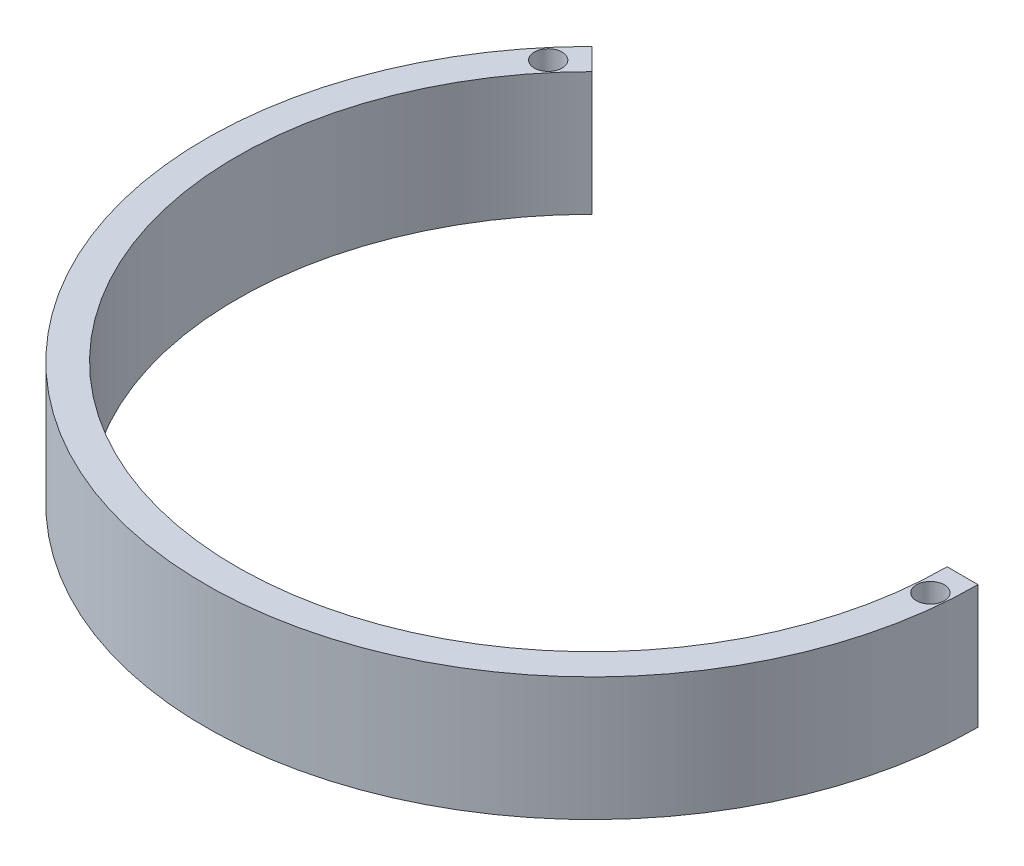
ISO-10303-21;
HEADER;
FILE_DESCRIPTION(('STEP AP214'),'2;1');
FILE_NAME('part.step','',(''),(''),'','','');
FILE_SCHEMA(('AUTOMOTIVE_DESIGN { 1 0 10303 214 1 1 1 1 }'));
ENDSEC;
DATA;
#1=APPLICATION_CONTEXT('core data for automotive mechanical design processes');
#2=APPLICATION_PROTOCOL_DEFINITION('international standard','automotive_design',2000,#1);
#3=PRODUCT_CONTEXT('',#1,'mechanical');
#4=PRODUCT('Part','Part','',(#3));
#5=PRODUCT_RELATED_PRODUCT_CATEGORY('part','',(#4));
#6=PRODUCT_DEFINITION_FORMATION('','',#4);
#7=PRODUCT_DEFINITION_CONTEXT('part definition',#1,'design');
#8=PRODUCT_DEFINITION('design','',#6,#7);
#9=PRODUCT_DEFINITION_SHAPE('','',#8);
#10=(LENGTH_UNIT() NAMED_UNIT(*) SI_UNIT(.MILLI.,.METRE.));
#11=(NAMED_UNIT(*) PLANE_ANGLE_UNIT() SI_UNIT($,.RADIAN.));
#12=(NAMED_UNIT(*) SI_UNIT($,.STERADIAN.) SOLID_ANGLE_UNIT());
#13=UNCERTAINTY_MEASURE_WITH_UNIT(LENGTH_MEASURE(1.E-05),#10,'distance_accuracy_value','');
#14=(GEOMETRIC_REPRESENTATION_CONTEXT(3) GLOBAL_UNCERTAINTY_ASSIGNED_CONTEXT((#13)) GLOBAL_UNIT_ASSIGNED_CONTEXT((#10,
#11,#12)) REPRESENTATION_CONTEXT('',''));
#15=CARTESIAN_POINT('',(0.,0.,0.));
#16=DIRECTION('',(0.,0.,1.));
#17=DIRECTION('',(1.,0.,0.));
#18=AXIS2_PLACEMENT_3D('',#15,#16,#17);
#19=CARTESIAN_POINT('',(0.,0.,0.));
#20=DIRECTION('',(0.,0.,-1.));
#21=DIRECTION('',(-1.,0.,0.));
#22=AXIS2_PLACEMENT_3D('',#19,#20,#21);
#23=PLANE('',#22);
#24=DIRECTION('',(-1.,0.,0.));
#25=VECTOR('',#24,1.);
#26=CARTESIAN_POINT('',(62.5,-10.,0.));
#27=LINE('',#26,#25);
#28=CARTESIAN_POINT('',(62.5,-10.,0.));
#29=VERTEX_POINT('',#28);
#30=CARTESIAN_POINT('',(57.5,-10.,0.));
#31=VERTEX_POINT('',#30);
#32=EDGE_CURVE('E92',#29,#31,#27,.T.);
#33=ORIENTED_EDGE('',*,*,#32,.T.);
#34=DIRECTION('',(0.,1.,0.));
#35=VECTOR('',#34,1.);
#36=CARTESIAN_POINT('',(57.5,-10.,0.));
#37=LINE('',#36,#35);
#38=CARTESIAN_POINT('',(57.5,10.,0.));
#39=VERTEX_POINT('',#38);
#40=EDGE_CURVE('E85',#31,#39,#37,.T.);
#41=ORIENTED_EDGE('',*,*,#40,.T.);
#42=DIRECTION('',(1.,0.,0.));
#43=VECTOR('',#42,1.);
#44=CARTESIAN_POINT('',(62.5,10.,0.));
#45=LINE('',#44,#43);
#46=CARTESIAN_POINT('',(62.5,10.,0.));
#47=VERTEX_POINT('',#46);
#48=EDGE_CURVE('E80',#39,#47,#45,.T.);
#49=ORIENTED_EDGE('',*,*,#48,.T.);
#50=DIRECTION('',(0.,-1.,0.));
#51=VECTOR('',#50,1.);
#52=CARTESIAN_POINT('',(62.5,-10.,0.));
#53=LINE('',#52,#51);
#54=EDGE_CURVE('E75',#47,#29,#53,.T.);
#55=ORIENTED_EDGE('',*,*,#54,.T.);
#56=EDGE_LOOP('',(#33,#41,#49,#55));
#57=FACE_BOUND('',#56,.T.);
#58=ADVANCED_FACE('F41',(#57),#23,.T.);
#59=CARTESIAN_POINT('',(0.,0.,0.));
#60=DIRECTION('',(-0.707106781186544,0.,0.707106781186551));
#61=DIRECTION('',(0.707106781186551,0.,0.707106781186544));
#62=AXIS2_PLACEMENT_3D('',#59,#60,#61);
#63=PLANE('',#62);
#64=DIRECTION('',(0.707106781186551,0.,0.707106781186544));
#65=VECTOR('',#64,1.);
#66=CARTESIAN_POINT('',(-44.1941738241594,-10.,-44.194173824159));
#67=LINE('',#66,#65);
#68=CARTESIAN_POINT('',(-44.1941738241594,-10.,-44.194173824159));
#69=VERTEX_POINT('',#68);
#70=CARTESIAN_POINT('',(-40.6586399182267,-10.,-40.6586399182263));
#71=VERTEX_POINT('',#70);
#72=EDGE_CURVE('E108',#69,#71,#67,.T.);
#73=ORIENTED_EDGE('',*,*,#72,.F.);
#74=DIRECTION('',(0.,-1.,0.));
#75=VECTOR('',#74,1.);
#76=CARTESIAN_POINT('',(-44.1941738241594,-10.,-44.194173824159));
#77=LINE('',#76,#75);
#78=CARTESIAN_POINT('',(-44.1941738241594,10.,-44.194173824159));
#79=VERTEX_POINT('',#78);
#80=EDGE_CURVE('E11',#79,#69,#77,.T.);
#81=ORIENTED_EDGE('',*,*,#80,.F.);
#82=DIRECTION('',(-0.707106781186551,0.,-0.707106781186544));
#83=VECTOR('',#82,1.);
#84=CARTESIAN_POINT('',(-44.1941738241594,10.,-44.194173824159));
#85=LINE('',#84,#83);
#86=CARTESIAN_POINT('',(-40.6586399182267,10.,-40.6586399182263));
#87=VERTEX_POINT('',#86);
#88=EDGE_CURVE('E48',#87,#79,#85,.T.);
#89=ORIENTED_EDGE('',*,*,#88,.F.);
#90=DIRECTION('',(0.,1.,0.));
#91=VECTOR('',#90,1.);
#92=CARTESIAN_POINT('',(-40.6586399182267,-10.,-40.6586399182263));
#93=LINE('',#92,#91);
#94=EDGE_CURVE('E63',#71,#87,#93,.T.);
#95=ORIENTED_EDGE('',*,*,#94,.F.);
#96=EDGE_LOOP('',(#73,#81,#89,#95));
#97=FACE_BOUND('',#96,.T.);
#98=ADVANCED_FACE('F131',(#97),#63,.F.);
#99=CARTESIAN_POINT('',(62.5,-10.,0.));
#100=DIRECTION('',(0.,1.,0.));
#101=DIRECTION('',(0.,0.,1.));
#102=AXIS2_PLACEMENT_3D('',#99,#100,#101);
#103=PLANE('',#102);
#104=CARTESIAN_POINT('',(59.791303715507,-10.,4.99999999999999));
#105=DIRECTION('',(0.,-1.,0.));
#106=DIRECTION('',(0.,0.,-1.));
#107=AXIS2_PLACEMENT_3D('',#104,#105,#106);
#108=CIRCLE('',#107,2.24999999999999);
#109=CARTESIAN_POINT('',(59.791303715507,-10.,2.75));
#110=VERTEX_POINT('',#109);
#111=EDGE_CURVE('E122',#110,#110,#108,.T.);
#112=ORIENTED_EDGE('',*,*,#111,.F.);
#113=EDGE_LOOP('',(#112));
#114=FACE_BOUND('',#113,.T.);
#115=CARTESIAN_POINT('',(-45.8143702191521,-10.,-38.7433024072867));
#116=DIRECTION('',(0.,-1.,0.));
#117=DIRECTION('',(0.,0.,-1.));
#118=AXIS2_PLACEMENT_3D('',#115,#116,#117);
#119=CIRCLE('',#118,2.24999999999999);
#120=CARTESIAN_POINT('',(-45.8143702191521,-10.,-40.9933024072866));
#121=VERTEX_POINT('',#120);
#122=EDGE_CURVE('E116',#121,#121,#119,.T.);
#123=ORIENTED_EDGE('',*,*,#122,.F.);
#124=EDGE_LOOP('',(#123));
#125=FACE_BOUND('',#124,.T.);
#126=CARTESIAN_POINT('',(0.,-10.,0.));
#127=DIRECTION('',(0.,-1.,0.));
#128=DIRECTION('',(1.,0.,0.));
#129=AXIS2_PLACEMENT_3D('',#126,#127,#128);
#130=CIRCLE('',#129,57.5);
#131=EDGE_CURVE('E95',#31,#71,#130,.T.);
#132=ORIENTED_EDGE('',*,*,#131,.F.);
#133=ORIENTED_EDGE('',*,*,#32,.F.);
#134=CARTESIAN_POINT('',(0.,-10.,0.));
#135=DIRECTION('',(0.,-1.,0.));
#136=DIRECTION('',(1.,0.,0.));
#137=AXIS2_PLACEMENT_3D('',#134,#135,#136);
#138=CIRCLE('',#137,62.5);
#139=EDGE_CURVE('E94',#29,#69,#138,.T.);
#140=ORIENTED_EDGE('',*,*,#139,.T.);
#141=ORIENTED_EDGE('',*,*,#72,.T.);
#142=EDGE_LOOP('',(#132,#133,#140,#141));
#143=FACE_BOUND('',#142,.T.);
#144=ADVANCED_FACE('F93',(#114,#125,#143),#103,.F.);
#145=CARTESIAN_POINT('',(0.,0.,0.));
#146=DIRECTION('',(0.,-1.,0.));
#147=DIRECTION('',(0.,0.,-1.));
#148=AXIS2_PLACEMENT_3D('',#145,#146,#147);
#149=CYLINDRICAL_SURFACE('',#148,57.5);
#150=CARTESIAN_POINT('',(0.,10.,0.));
#151=DIRECTION('',(0.,-1.,0.));
#152=DIRECTION('',(1.,0.,0.));
#153=AXIS2_PLACEMENT_3D('',#150,#151,#152);
#154=CIRCLE('',#153,57.5);
#155=EDGE_CURVE('E102',#39,#87,#154,.T.);
#156=ORIENTED_EDGE('',*,*,#155,.F.);
#157=ORIENTED_EDGE('',*,*,#40,.F.);
#158=ORIENTED_EDGE('',*,*,#131,.T.);
#159=ORIENTED_EDGE('',*,*,#94,.T.);
#160=EDGE_LOOP('',(#156,#157,#158,#159));
#161=FACE_BOUND('',#160,.T.);
#162=ADVANCED_FACE('F130',(#161),#149,.F.);
#163=CARTESIAN_POINT('',(62.5,10.,0.));
#164=DIRECTION('',(0.,-1.,0.));
#165=DIRECTION('',(0.,0.,-1.));
#166=AXIS2_PLACEMENT_3D('',#163,#164,#165);
#167=PLANE('',#166);
#168=CARTESIAN_POINT('',(59.791303715507,10.,4.99999999999999));
#169=DIRECTION('',(0.,-1.,0.));
#170=DIRECTION('',(0.,0.,-1.));
#171=AXIS2_PLACEMENT_3D('',#168,#169,#170);
#172=CIRCLE('',#171,2.25);
#173=CARTESIAN_POINT('',(59.791303715507,10.,2.75));
#174=VERTEX_POINT('',#173);
#175=EDGE_CURVE('E119',#174,#174,#172,.T.);
#176=ORIENTED_EDGE('',*,*,#175,.T.);
#177=EDGE_LOOP('',(#176));
#178=FACE_BOUND('',#177,.T.);
#179=CARTESIAN_POINT('',(-45.8143702191521,10.,-38.7433024072867));
#180=DIRECTION('',(0.,-1.,0.));
#181=DIRECTION('',(0.,0.,-1.));
#182=AXIS2_PLACEMENT_3D('',#179,#180,#181);
#183=CIRCLE('',#182,2.25);
#184=CARTESIAN_POINT('',(-45.8143702191521,10.,-40.9933024072867));
#185=VERTEX_POINT('',#184);
#186=EDGE_CURVE('E97',#185,#185,#183,.T.);
#187=ORIENTED_EDGE('',*,*,#186,.T.);
#188=EDGE_LOOP('',(#187));
#189=FACE_BOUND('',#188,.T.);
#190=CARTESIAN_POINT('',(0.,10.,0.));
#191=DIRECTION('',(0.,-1.,0.));
#192=DIRECTION('',(1.,0.,0.));
#193=AXIS2_PLACEMENT_3D('',#190,#191,#192);
#194=CIRCLE('',#193,62.5);
#195=EDGE_CURVE('E110',#47,#79,#194,.T.);
#196=ORIENTED_EDGE('',*,*,#195,.F.);
#197=ORIENTED_EDGE('',*,*,#48,.F.);
#198=ORIENTED_EDGE('',*,*,#155,.T.);
#199=ORIENTED_EDGE('',*,*,#88,.T.);
#200=EDGE_LOOP('',(#196,#197,#198,#199));
#201=FACE_BOUND('',#200,.T.);
#202=ADVANCED_FACE('F146',(#178,#189,#201),#167,.F.);
#203=CARTESIAN_POINT('',(0.,0.,0.));
#204=DIRECTION('',(0.,-1.,0.));
#205=DIRECTION('',(0.,0.,-1.));
#206=AXIS2_PLACEMENT_3D('',#203,#204,#205);
#207=CYLINDRICAL_SURFACE('',#206,62.5);
#208=ORIENTED_EDGE('',*,*,#80,.T.);
#209=ORIENTED_EDGE('',*,*,#139,.F.);
#210=ORIENTED_EDGE('',*,*,#54,.F.);
#211=ORIENTED_EDGE('',*,*,#195,.T.);
#212=EDGE_LOOP('',(#208,#209,#210,#211));
#213=FACE_BOUND('',#212,.T.);
#214=ADVANCED_FACE('F99',(#213),#207,.T.);
#215=CARTESIAN_POINT('',(-45.8143702191521,-10.,-38.7433024072867));
#216=DIRECTION('',(0.,-1.,0.));
#217=DIRECTION('',(0.,0.,-1.));
#218=AXIS2_PLACEMENT_3D('',#215,#216,#217);
#219=CYLINDRICAL_SURFACE('',#218,2.24999999999999);
#220=ORIENTED_EDGE('',*,*,#186,.F.);
#221=EDGE_LOOP('',(#220));
#222=FACE_BOUND('',#221,.T.);
#223=ORIENTED_EDGE('',*,*,#122,.T.);
#224=EDGE_LOOP('',(#223));
#225=FACE_BOUND('',#224,.T.);
#226=ADVANCED_FACE('F135',(#222,#225),#219,.F.);
#227=CARTESIAN_POINT('',(59.791303715507,-10.,4.99999999999999));
#228=DIRECTION('',(0.,-1.,0.));
#229=DIRECTION('',(0.,0.,-1.));
#230=AXIS2_PLACEMENT_3D('',#227,#228,#229);
#231=CYLINDRICAL_SURFACE('',#230,2.24999999999999);
#232=ORIENTED_EDGE('',*,*,#175,.F.);
#233=EDGE_LOOP('',(#232));
#234=FACE_BOUND('',#233,.T.);
#235=ORIENTED_EDGE('',*,*,#111,.T.);
#236=EDGE_LOOP('',(#235));
#237=FACE_BOUND('',#236,.T.);
#238=ADVANCED_FACE('F126',(#234,#237),#231,.F.);
#239=CLOSED_SHELL('',(#58,#98,#144,#162,#202,#214,#226,#238));
#240=MANIFOLD_SOLID_BREP('B2',#239);
#241=ADVANCED_BREP_SHAPE_REPRESENTATION('',(#18,#240),#14);
#242=SHAPE_DEFINITION_REPRESENTATION(#9,#241);
ENDSEC;
END-ISO-10303-21;
